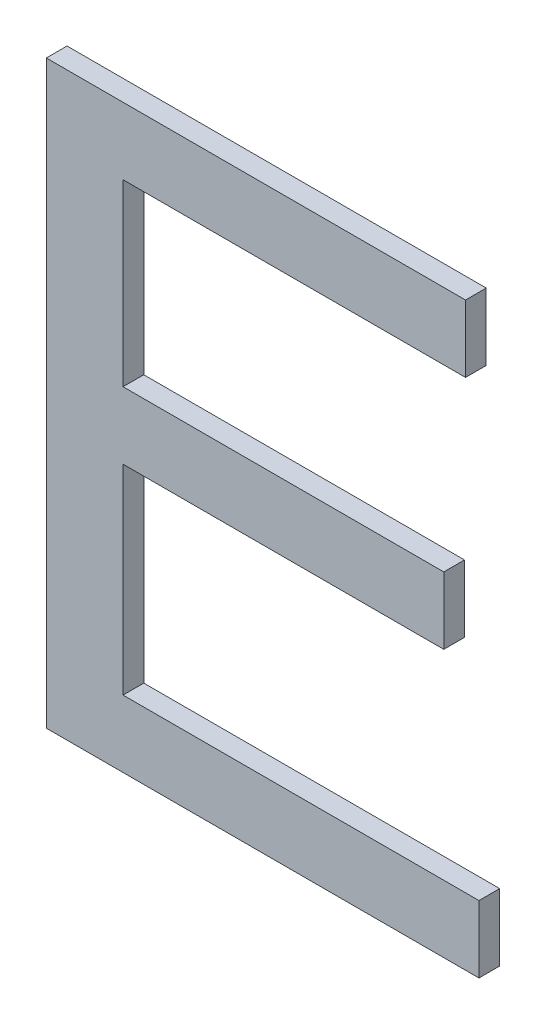
ISO-10303-21;
HEADER;
FILE_DESCRIPTION(('STEP AP214'),'2;1');
FILE_NAME('part.step','',(''),(''),'','','');
FILE_SCHEMA(('AUTOMOTIVE_DESIGN { 1 0 10303 214 1 1 1 1 }'));
ENDSEC;
DATA;
#1=APPLICATION_CONTEXT('core data for automotive mechanical design processes');
#2=APPLICATION_PROTOCOL_DEFINITION('international standard','automotive_design',2000,#1);
#3=PRODUCT_CONTEXT('',#1,'mechanical');
#4=PRODUCT('Part','Part','',(#3));
#5=PRODUCT_RELATED_PRODUCT_CATEGORY('part','',(#4));
#6=PRODUCT_DEFINITION_FORMATION('','',#4);
#7=PRODUCT_DEFINITION_CONTEXT('part definition',#1,'design');
#8=PRODUCT_DEFINITION('design','',#6,#7);
#9=PRODUCT_DEFINITION_SHAPE('','',#8);
#10=(LENGTH_UNIT() NAMED_UNIT(*) SI_UNIT(.MILLI.,.METRE.));
#11=(NAMED_UNIT(*) PLANE_ANGLE_UNIT() SI_UNIT($,.RADIAN.));
#12=(NAMED_UNIT(*) SI_UNIT($,.STERADIAN.) SOLID_ANGLE_UNIT());
#13=UNCERTAINTY_MEASURE_WITH_UNIT(LENGTH_MEASURE(1.E-05),#10,'distance_accuracy_value','');
#14=(GEOMETRIC_REPRESENTATION_CONTEXT(3) GLOBAL_UNCERTAINTY_ASSIGNED_CONTEXT((#13)) GLOBAL_UNIT_ASSIGNED_CONTEXT((#10,
#11,#12)) REPRESENTATION_CONTEXT('',''));
#15=CARTESIAN_POINT('',(0.,0.,0.));
#16=DIRECTION('',(0.,0.,1.));
#17=DIRECTION('',(1.,0.,0.));
#18=AXIS2_PLACEMENT_3D('',#15,#16,#17);
#19=CARTESIAN_POINT('',(5.766661399078,0.6998032918,0.05));
#20=DIRECTION('',(0.,0.,1.));
#21=DIRECTION('',(1.,0.,0.));
#22=AXIS2_PLACEMENT_3D('',#19,#20,#21);
#23=PLANE('',#22);
#24=DIRECTION('',(0.,1.,0.));
#25=VECTOR('',#24,1.);
#26=CARTESIAN_POINT('',(5.319186046512,0.,0.05));
#27=LINE('',#26,#25);
#28=CARTESIAN_POINT('',(5.319186046512,0.,0.05));
#29=VERTEX_POINT('',#28);
#30=CARTESIAN_POINT('',(5.319186046512,1.4,0.05));
#31=VERTEX_POINT('',#30);
#32=EDGE_CURVE('E175',#29,#31,#27,.T.);
#33=ORIENTED_EDGE('',*,*,#32,.F.);
#34=DIRECTION('',(-1.,0.,0.));
#35=VECTOR('',#34,1.);
#36=CARTESIAN_POINT('',(6.362699854651,0.,0.05));
#37=LINE('',#36,#35);
#38=CARTESIAN_POINT('',(6.362699854651,0.,0.05));
#39=VERTEX_POINT('',#38);
#40=EDGE_CURVE('E206',#39,#29,#37,.T.);
#41=ORIENTED_EDGE('',*,*,#40,.F.);
#42=DIRECTION('',(0.,-1.,0.));
#43=VECTOR('',#42,1.);
#44=CARTESIAN_POINT('',(6.362699854651,0.161773255814,0.05));
#45=LINE('',#44,#43);
#46=CARTESIAN_POINT('',(6.362699854651,0.161773255814,0.05));
#47=VERTEX_POINT('',#46);
#48=EDGE_CURVE('E200',#47,#39,#45,.T.);
#49=ORIENTED_EDGE('',*,*,#48,.F.);
#50=DIRECTION('',(1.,0.,0.));
#51=VECTOR('',#50,1.);
#52=CARTESIAN_POINT('',(5.504233284884,0.161773255814,0.05));
#53=LINE('',#52,#51);
#54=CARTESIAN_POINT('',(5.504233284884,0.161773255814,0.05));
#55=VERTEX_POINT('',#54);
#56=EDGE_CURVE('E180',#55,#47,#53,.T.);
#57=ORIENTED_EDGE('',*,*,#56,.F.);
#58=DIRECTION('',(0.,-1.,0.));
#59=VECTOR('',#58,1.);
#60=CARTESIAN_POINT('',(5.504233284884,0.644040697674,0.05));
#61=LINE('',#60,#59);
#62=CARTESIAN_POINT('',(5.504233284884,0.644040697674,0.05));
#63=VERTEX_POINT('',#62);
#64=EDGE_CURVE('E89',#63,#55,#61,.T.);
#65=ORIENTED_EDGE('',*,*,#64,.F.);
#66=DIRECTION('',(-1.,0.,0.));
#67=VECTOR('',#66,1.);
#68=CARTESIAN_POINT('',(6.277807049419,0.644040697674,0.05));
#69=LINE('',#68,#67);
#70=CARTESIAN_POINT('',(6.277807049419,0.644040697674,0.05));
#71=VERTEX_POINT('',#70);
#72=EDGE_CURVE('E205',#71,#63,#69,.T.);
#73=ORIENTED_EDGE('',*,*,#72,.F.);
#74=DIRECTION('',(0.,-1.,0.));
#75=VECTOR('',#74,1.);
#76=CARTESIAN_POINT('',(6.277807049419,0.805813953488,0.05));
#77=LINE('',#76,#75);
#78=CARTESIAN_POINT('',(6.277807049419,0.805813953488,0.05));
#79=VERTEX_POINT('',#78);
#80=EDGE_CURVE('E191',#79,#71,#77,.T.);
#81=ORIENTED_EDGE('',*,*,#80,.F.);
#82=DIRECTION('',(1.,0.,0.));
#83=VECTOR('',#82,1.);
#84=CARTESIAN_POINT('',(5.504233284884,0.805813953488,0.05));
#85=LINE('',#84,#83);
#86=CARTESIAN_POINT('',(5.504233284884,0.805813953488,0.05));
#87=VERTEX_POINT('',#86);
#88=EDGE_CURVE('E221',#87,#79,#85,.T.);
#89=ORIENTED_EDGE('',*,*,#88,.F.);
#90=DIRECTION('',(0.,-1.,0.));
#91=VECTOR('',#90,1.);
#92=CARTESIAN_POINT('',(5.504233284884,1.238226744186,0.05));
#93=LINE('',#92,#91);
#94=CARTESIAN_POINT('',(5.504233284884,1.238226744186,0.05));
#95=VERTEX_POINT('',#94);
#96=EDGE_CURVE('E169',#95,#87,#93,.T.);
#97=ORIENTED_EDGE('',*,*,#96,.F.);
#98=DIRECTION('',(-1.,0.,0.));
#99=VECTOR('',#98,1.);
#100=CARTESIAN_POINT('',(6.330268895349,1.238226744186,0.05));
#101=LINE('',#100,#99);
#102=CARTESIAN_POINT('',(6.330268895349,1.238226744186,0.05));
#103=VERTEX_POINT('',#102);
#104=EDGE_CURVE('E156',#103,#95,#101,.T.);
#105=ORIENTED_EDGE('',*,*,#104,.F.);
#106=DIRECTION('',(0.,-1.,0.));
#107=VECTOR('',#106,1.);
#108=CARTESIAN_POINT('',(6.330268895349,1.4,0.05));
#109=LINE('',#108,#107);
#110=CARTESIAN_POINT('',(6.330268895349,1.4,0.05));
#111=VERTEX_POINT('',#110);
#112=EDGE_CURVE('E145',#111,#103,#109,.T.);
#113=ORIENTED_EDGE('',*,*,#112,.F.);
#114=DIRECTION('',(1.,0.,0.));
#115=VECTOR('',#114,1.);
#116=CARTESIAN_POINT('',(5.319186046512,1.4,0.05));
#117=LINE('',#116,#115);
#118=EDGE_CURVE('E28',#31,#111,#117,.T.);
#119=ORIENTED_EDGE('',*,*,#118,.F.);
#120=EDGE_LOOP('',(#33,#41,#49,#57,#65,#73,#81,#89,#97,#105,#113,#119));
#121=FACE_BOUND('',#120,.T.);
#122=ADVANCED_FACE('F17',(#121),#23,.T.);
#123=CARTESIAN_POINT('',(5.766661399078,0.6998032918,0.));
#124=DIRECTION('',(0.,0.,1.));
#125=DIRECTION('',(1.,0.,0.));
#126=AXIS2_PLACEMENT_3D('',#123,#124,#125);
#127=PLANE('',#126);
#128=DIRECTION('',(1.,0.,0.));
#129=VECTOR('',#128,1.);
#130=CARTESIAN_POINT('',(5.319186046512,1.4,0.));
#131=LINE('',#130,#129);
#132=CARTESIAN_POINT('',(5.319186046512,1.4,0.));
#133=VERTEX_POINT('',#132);
#134=CARTESIAN_POINT('',(6.330268895349,1.4,0.));
#135=VERTEX_POINT('',#134);
#136=EDGE_CURVE('E11',#133,#135,#131,.T.);
#137=ORIENTED_EDGE('',*,*,#136,.T.);
#138=DIRECTION('',(0.,-1.,0.));
#139=VECTOR('',#138,1.);
#140=CARTESIAN_POINT('',(6.330268895349,1.4,0.));
#141=LINE('',#140,#139);
#142=CARTESIAN_POINT('',(6.330268895349,1.238226744186,0.));
#143=VERTEX_POINT('',#142);
#144=EDGE_CURVE('E135',#135,#143,#141,.T.);
#145=ORIENTED_EDGE('',*,*,#144,.T.);
#146=DIRECTION('',(-1.,0.,0.));
#147=VECTOR('',#146,1.);
#148=CARTESIAN_POINT('',(6.330268895349,1.238226744186,0.));
#149=LINE('',#148,#147);
#150=CARTESIAN_POINT('',(5.504233284884,1.238226744186,0.));
#151=VERTEX_POINT('',#150);
#152=EDGE_CURVE('E138',#143,#151,#149,.T.);
#153=ORIENTED_EDGE('',*,*,#152,.T.);
#154=DIRECTION('',(0.,-1.,0.));
#155=VECTOR('',#154,1.);
#156=CARTESIAN_POINT('',(5.504233284884,1.238226744186,0.));
#157=LINE('',#156,#155);
#158=CARTESIAN_POINT('',(5.504233284884,0.805813953488,0.));
#159=VERTEX_POINT('',#158);
#160=EDGE_CURVE('E161',#151,#159,#157,.T.);
#161=ORIENTED_EDGE('',*,*,#160,.T.);
#162=DIRECTION('',(1.,0.,0.));
#163=VECTOR('',#162,1.);
#164=CARTESIAN_POINT('',(5.504233284884,0.805813953488,0.));
#165=LINE('',#164,#163);
#166=CARTESIAN_POINT('',(6.277807049419,0.805813953488,0.));
#167=VERTEX_POINT('',#166);
#168=EDGE_CURVE('E173',#159,#167,#165,.T.);
#169=ORIENTED_EDGE('',*,*,#168,.T.);
#170=DIRECTION('',(0.,-1.,0.));
#171=VECTOR('',#170,1.);
#172=CARTESIAN_POINT('',(6.277807049419,0.805813953488,0.));
#173=LINE('',#172,#171);
#174=CARTESIAN_POINT('',(6.277807049419,0.644040697674,0.));
#175=VERTEX_POINT('',#174);
#176=EDGE_CURVE('E195',#167,#175,#173,.T.);
#177=ORIENTED_EDGE('',*,*,#176,.T.);
#178=DIRECTION('',(-1.,0.,0.));
#179=VECTOR('',#178,1.);
#180=CARTESIAN_POINT('',(6.277807049419,0.644040697674,0.));
#181=LINE('',#180,#179);
#182=CARTESIAN_POINT('',(5.504233284884,0.644040697674,0.));
#183=VERTEX_POINT('',#182);
#184=EDGE_CURVE('E202',#175,#183,#181,.T.);
#185=ORIENTED_EDGE('',*,*,#184,.T.);
#186=DIRECTION('',(0.,-1.,0.));
#187=VECTOR('',#186,1.);
#188=CARTESIAN_POINT('',(5.504233284884,0.644040697674,0.));
#189=LINE('',#188,#187);
#190=CARTESIAN_POINT('',(5.504233284884,0.161773255814,0.));
#191=VERTEX_POINT('',#190);
#192=EDGE_CURVE('E101',#183,#191,#189,.T.);
#193=ORIENTED_EDGE('',*,*,#192,.T.);
#194=DIRECTION('',(1.,0.,0.));
#195=VECTOR('',#194,1.);
#196=CARTESIAN_POINT('',(5.504233284884,0.161773255814,0.));
#197=LINE('',#196,#195);
#198=CARTESIAN_POINT('',(6.362699854651,0.161773255814,0.));
#199=VERTEX_POINT('',#198);
#200=EDGE_CURVE('E183',#191,#199,#197,.T.);
#201=ORIENTED_EDGE('',*,*,#200,.T.);
#202=DIRECTION('',(0.,-1.,0.));
#203=VECTOR('',#202,1.);
#204=CARTESIAN_POINT('',(6.362699854651,0.161773255814,0.));
#205=LINE('',#204,#203);
#206=CARTESIAN_POINT('',(6.362699854651,0.,0.));
#207=VERTEX_POINT('',#206);
#208=EDGE_CURVE('E256',#199,#207,#205,.T.);
#209=ORIENTED_EDGE('',*,*,#208,.T.);
#210=DIRECTION('',(-1.,0.,0.));
#211=VECTOR('',#210,1.);
#212=CARTESIAN_POINT('',(6.362699854651,0.,0.));
#213=LINE('',#212,#211);
#214=CARTESIAN_POINT('',(5.319186046512,0.,0.));
#215=VERTEX_POINT('',#214);
#216=EDGE_CURVE('E201',#207,#215,#213,.T.);
#217=ORIENTED_EDGE('',*,*,#216,.T.);
#218=DIRECTION('',(0.,1.,0.));
#219=VECTOR('',#218,1.);
#220=CARTESIAN_POINT('',(5.319186046512,0.,0.));
#221=LINE('',#220,#219);
#222=EDGE_CURVE('E187',#215,#133,#221,.T.);
#223=ORIENTED_EDGE('',*,*,#222,.T.);
#224=EDGE_LOOP('',(#137,#145,#153,#161,#169,#177,#185,#193,#201,#209,#217,#223));
#225=FACE_BOUND('',#224,.T.);
#226=ADVANCED_FACE('F137',(#225),#127,.F.);
#227=CARTESIAN_POINT('',(5.319186046512,1.4,0.));
#228=DIRECTION('',(0.,1.,0.));
#229=DIRECTION('',(1.,0.,0.));
#230=AXIS2_PLACEMENT_3D('',#227,#228,#229);
#231=PLANE('',#230);
#232=DIRECTION('',(0.,0.,1.));
#233=VECTOR('',#232,1.);
#234=CARTESIAN_POINT('',(5.319186046512,1.4,0.));
#235=LINE('',#234,#233);
#236=EDGE_CURVE('E178',#133,#31,#235,.T.);
#237=ORIENTED_EDGE('',*,*,#236,.T.);
#238=ORIENTED_EDGE('',*,*,#118,.T.);
#239=DIRECTION('',(0.,0.,1.));
#240=VECTOR('',#239,1.);
#241=CARTESIAN_POINT('',(6.330268895349,1.4,0.));
#242=LINE('',#241,#240);
#243=EDGE_CURVE('E155',#135,#111,#242,.T.);
#244=ORIENTED_EDGE('',*,*,#243,.F.);
#245=ORIENTED_EDGE('',*,*,#136,.F.);
#246=EDGE_LOOP('',(#237,#238,#244,#245));
#247=FACE_BOUND('',#246,.T.);
#248=ADVANCED_FACE('F290',(#247),#231,.T.);
#249=CARTESIAN_POINT('',(6.330268895349,1.4,0.));
#250=DIRECTION('',(1.,0.,0.));
#251=DIRECTION('',(0.,1.,0.));
#252=AXIS2_PLACEMENT_3D('',#249,#250,#251);
#253=PLANE('',#252);
#254=ORIENTED_EDGE('',*,*,#243,.T.);
#255=ORIENTED_EDGE('',*,*,#112,.T.);
#256=DIRECTION('',(0.,0.,1.));
#257=VECTOR('',#256,1.);
#258=CARTESIAN_POINT('',(6.330268895349,1.238226744186,0.));
#259=LINE('',#258,#257);
#260=EDGE_CURVE('E151',#143,#103,#259,.T.);
#261=ORIENTED_EDGE('',*,*,#260,.F.);
#262=ORIENTED_EDGE('',*,*,#144,.F.);
#263=EDGE_LOOP('',(#254,#255,#261,#262));
#264=FACE_BOUND('',#263,.T.);
#265=ADVANCED_FACE('F158',(#264),#253,.T.);
#266=CARTESIAN_POINT('',(6.330268895349,1.238226744186,0.));
#267=DIRECTION('',(0.,-1.,0.));
#268=DIRECTION('',(0.,0.,-1.));
#269=AXIS2_PLACEMENT_3D('',#266,#267,#268);
#270=PLANE('',#269);
#271=ORIENTED_EDGE('',*,*,#260,.T.);
#272=ORIENTED_EDGE('',*,*,#104,.T.);
#273=DIRECTION('',(0.,0.,1.));
#274=VECTOR('',#273,1.);
#275=CARTESIAN_POINT('',(5.504233284884,1.238226744186,0.));
#276=LINE('',#275,#274);
#277=EDGE_CURVE('E153',#151,#95,#276,.T.);
#278=ORIENTED_EDGE('',*,*,#277,.F.);
#279=ORIENTED_EDGE('',*,*,#152,.F.);
#280=EDGE_LOOP('',(#271,#272,#278,#279));
#281=FACE_BOUND('',#280,.T.);
#282=ADVANCED_FACE('F150',(#281),#270,.T.);
#283=CARTESIAN_POINT('',(5.504233284884,1.238226744186,0.));
#284=DIRECTION('',(1.,0.,0.));
#285=DIRECTION('',(0.,1.,0.));
#286=AXIS2_PLACEMENT_3D('',#283,#284,#285);
#287=PLANE('',#286);
#288=ORIENTED_EDGE('',*,*,#277,.T.);
#289=ORIENTED_EDGE('',*,*,#96,.T.);
#290=DIRECTION('',(0.,0.,1.));
#291=VECTOR('',#290,1.);
#292=CARTESIAN_POINT('',(5.504233284884,0.805813953488,0.));
#293=LINE('',#292,#291);
#294=EDGE_CURVE('E223',#159,#87,#293,.T.);
#295=ORIENTED_EDGE('',*,*,#294,.F.);
#296=ORIENTED_EDGE('',*,*,#160,.F.);
#297=EDGE_LOOP('',(#288,#289,#295,#296));
#298=FACE_BOUND('',#297,.T.);
#299=ADVANCED_FACE('F309',(#298),#287,.T.);
#300=CARTESIAN_POINT('',(5.504233284884,0.805813953488,0.));
#301=DIRECTION('',(0.,1.,0.));
#302=DIRECTION('',(1.,0.,0.));
#303=AXIS2_PLACEMENT_3D('',#300,#301,#302);
#304=PLANE('',#303);
#305=ORIENTED_EDGE('',*,*,#294,.T.);
#306=ORIENTED_EDGE('',*,*,#88,.T.);
#307=DIRECTION('',(0.,0.,1.));
#308=VECTOR('',#307,1.);
#309=CARTESIAN_POINT('',(6.277807049419,0.805813953488,0.));
#310=LINE('',#309,#308);
#311=EDGE_CURVE('E21',#167,#79,#310,.T.);
#312=ORIENTED_EDGE('',*,*,#311,.F.);
#313=ORIENTED_EDGE('',*,*,#168,.F.);
#314=EDGE_LOOP('',(#305,#306,#312,#313));
#315=FACE_BOUND('',#314,.T.);
#316=ADVANCED_FACE('F311',(#315),#304,.T.);
#317=CARTESIAN_POINT('',(6.277807049419,0.805813953488,0.));
#318=DIRECTION('',(1.,0.,0.));
#319=DIRECTION('',(0.,1.,0.));
#320=AXIS2_PLACEMENT_3D('',#317,#318,#319);
#321=PLANE('',#320);
#322=ORIENTED_EDGE('',*,*,#311,.T.);
#323=ORIENTED_EDGE('',*,*,#80,.T.);
#324=DIRECTION('',(0.,0.,1.));
#325=VECTOR('',#324,1.);
#326=CARTESIAN_POINT('',(6.277807049419,0.644040697674,0.));
#327=LINE('',#326,#325);
#328=EDGE_CURVE('E219',#175,#71,#327,.T.);
#329=ORIENTED_EDGE('',*,*,#328,.F.);
#330=ORIENTED_EDGE('',*,*,#176,.F.);
#331=EDGE_LOOP('',(#322,#323,#329,#330));
#332=FACE_BOUND('',#331,.T.);
#333=ADVANCED_FACE('F335',(#332),#321,.T.);
#334=CARTESIAN_POINT('',(6.277807049419,0.644040697674,0.));
#335=DIRECTION('',(0.,-1.,0.));
#336=DIRECTION('',(0.,0.,-1.));
#337=AXIS2_PLACEMENT_3D('',#334,#335,#336);
#338=PLANE('',#337);
#339=ORIENTED_EDGE('',*,*,#328,.T.);
#340=ORIENTED_EDGE('',*,*,#72,.T.);
#341=DIRECTION('',(0.,0.,1.));
#342=VECTOR('',#341,1.);
#343=CARTESIAN_POINT('',(5.504233284884,0.644040697674,0.));
#344=LINE('',#343,#342);
#345=EDGE_CURVE('E212',#183,#63,#344,.T.);
#346=ORIENTED_EDGE('',*,*,#345,.F.);
#347=ORIENTED_EDGE('',*,*,#184,.F.);
#348=EDGE_LOOP('',(#339,#340,#346,#347));
#349=FACE_BOUND('',#348,.T.);
#350=ADVANCED_FACE('F19',(#349),#338,.T.);
#351=CARTESIAN_POINT('',(5.504233284884,0.644040697674,0.));
#352=DIRECTION('',(1.,0.,0.));
#353=DIRECTION('',(0.,1.,0.));
#354=AXIS2_PLACEMENT_3D('',#351,#352,#353);
#355=PLANE('',#354);
#356=ORIENTED_EDGE('',*,*,#345,.T.);
#357=ORIENTED_EDGE('',*,*,#64,.T.);
#358=DIRECTION('',(0.,0.,1.));
#359=VECTOR('',#358,1.);
#360=CARTESIAN_POINT('',(5.504233284884,0.161773255814,0.));
#361=LINE('',#360,#359);
#362=EDGE_CURVE('E184',#191,#55,#361,.T.);
#363=ORIENTED_EDGE('',*,*,#362,.F.);
#364=ORIENTED_EDGE('',*,*,#192,.F.);
#365=EDGE_LOOP('',(#356,#357,#363,#364));
#366=FACE_BOUND('',#365,.T.);
#367=ADVANCED_FACE('F321',(#366),#355,.T.);
#368=CARTESIAN_POINT('',(5.504233284884,0.161773255814,0.));
#369=DIRECTION('',(0.,1.,0.));
#370=DIRECTION('',(1.,0.,0.));
#371=AXIS2_PLACEMENT_3D('',#368,#369,#370);
#372=PLANE('',#371);
#373=ORIENTED_EDGE('',*,*,#362,.T.);
#374=ORIENTED_EDGE('',*,*,#56,.T.);
#375=DIRECTION('',(0.,0.,1.));
#376=VECTOR('',#375,1.);
#377=CARTESIAN_POINT('',(6.362699854651,0.161773255814,0.));
#378=LINE('',#377,#376);
#379=EDGE_CURVE('E196',#199,#47,#378,.T.);
#380=ORIENTED_EDGE('',*,*,#379,.F.);
#381=ORIENTED_EDGE('',*,*,#200,.F.);
#382=EDGE_LOOP('',(#373,#374,#380,#381));
#383=FACE_BOUND('',#382,.T.);
#384=ADVANCED_FACE('F315',(#383),#372,.T.);
#385=CARTESIAN_POINT('',(6.362699854651,0.161773255814,0.));
#386=DIRECTION('',(1.,0.,0.));
#387=DIRECTION('',(0.,1.,0.));
#388=AXIS2_PLACEMENT_3D('',#385,#386,#387);
#389=PLANE('',#388);
#390=ORIENTED_EDGE('',*,*,#379,.T.);
#391=ORIENTED_EDGE('',*,*,#48,.T.);
#392=DIRECTION('',(0.,0.,1.));
#393=VECTOR('',#392,1.);
#394=CARTESIAN_POINT('',(6.362699854651,0.,0.));
#395=LINE('',#394,#393);
#396=EDGE_CURVE('E209',#207,#39,#395,.T.);
#397=ORIENTED_EDGE('',*,*,#396,.F.);
#398=ORIENTED_EDGE('',*,*,#208,.F.);
#399=EDGE_LOOP('',(#390,#391,#397,#398));
#400=FACE_BOUND('',#399,.T.);
#401=ADVANCED_FACE('F313',(#400),#389,.T.);
#402=CARTESIAN_POINT('',(6.362699854651,0.,0.));
#403=DIRECTION('',(0.,-1.,0.));
#404=DIRECTION('',(0.,0.,-1.));
#405=AXIS2_PLACEMENT_3D('',#402,#403,#404);
#406=PLANE('',#405);
#407=ORIENTED_EDGE('',*,*,#396,.T.);
#408=ORIENTED_EDGE('',*,*,#40,.T.);
#409=DIRECTION('',(0.,0.,1.));
#410=VECTOR('',#409,1.);
#411=CARTESIAN_POINT('',(5.319186046512,0.,0.));
#412=LINE('',#411,#410);
#413=EDGE_CURVE('E179',#215,#29,#412,.T.);
#414=ORIENTED_EDGE('',*,*,#413,.F.);
#415=ORIENTED_EDGE('',*,*,#216,.F.);
#416=EDGE_LOOP('',(#407,#408,#414,#415));
#417=FACE_BOUND('',#416,.T.);
#418=ADVANCED_FACE('F287',(#417),#406,.T.);
#419=CARTESIAN_POINT('',(5.319186046512,0.,0.));
#420=DIRECTION('',(-1.,0.,0.));
#421=DIRECTION('',(0.,0.,1.));
#422=AXIS2_PLACEMENT_3D('',#419,#420,#421);
#423=PLANE('',#422);
#424=ORIENTED_EDGE('',*,*,#413,.T.);
#425=ORIENTED_EDGE('',*,*,#32,.T.);
#426=ORIENTED_EDGE('',*,*,#236,.F.);
#427=ORIENTED_EDGE('',*,*,#222,.F.);
#428=EDGE_LOOP('',(#424,#425,#426,#427));
#429=FACE_BOUND('',#428,.T.);
#430=ADVANCED_FACE('F286',(#429),#423,.T.);
#431=CLOSED_SHELL('',(#122,#226,#248,#265,#282,#299,#316,#333,#350,#367,#384,#401,#418,#430));
#432=MANIFOLD_SOLID_BREP('B1',#431);
#433=ADVANCED_BREP_SHAPE_REPRESENTATION('',(#18,#432),#14);
#434=SHAPE_DEFINITION_REPRESENTATION(#9,#433);
ENDSEC;
END-ISO-10303-21;
